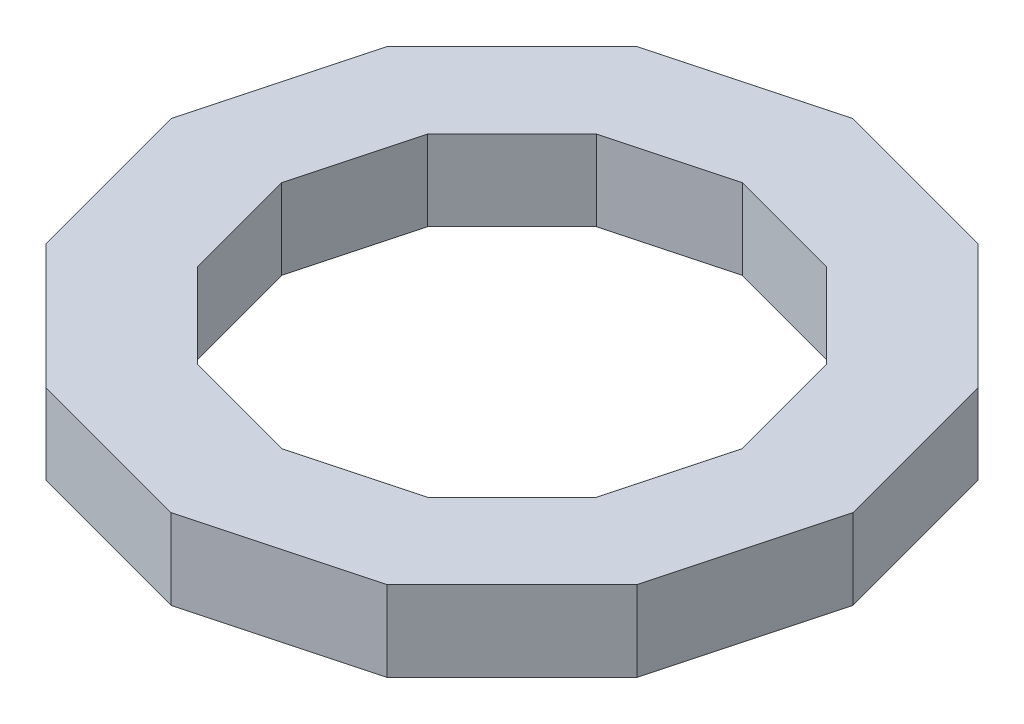
ISO-10303-21;
HEADER;
FILE_DESCRIPTION(('STEP AP214'),'2;1');
FILE_NAME('part.step','',(''),(''),'','','');
FILE_SCHEMA(('AUTOMOTIVE_DESIGN { 1 0 10303 214 1 1 1 1 }'));
ENDSEC;
DATA;
#1=APPLICATION_CONTEXT('core data for automotive mechanical design processes');
#2=APPLICATION_PROTOCOL_DEFINITION('international standard','automotive_design',2000,#1);
#3=PRODUCT_CONTEXT('',#1,'mechanical');
#4=PRODUCT('Part','Part','',(#3));
#5=PRODUCT_RELATED_PRODUCT_CATEGORY('part','',(#4));
#6=PRODUCT_DEFINITION_FORMATION('','',#4);
#7=PRODUCT_DEFINITION_CONTEXT('part definition',#1,'design');
#8=PRODUCT_DEFINITION('design','',#6,#7);
#9=PRODUCT_DEFINITION_SHAPE('','',#8);
#10=(LENGTH_UNIT() NAMED_UNIT(*) SI_UNIT(.MILLI.,.METRE.));
#11=(NAMED_UNIT(*) PLANE_ANGLE_UNIT() SI_UNIT($,.RADIAN.));
#12=(NAMED_UNIT(*) SI_UNIT($,.STERADIAN.) SOLID_ANGLE_UNIT());
#13=UNCERTAINTY_MEASURE_WITH_UNIT(LENGTH_MEASURE(1.E-05),#10,'distance_accuracy_value','');
#14=(GEOMETRIC_REPRESENTATION_CONTEXT(3) GLOBAL_UNCERTAINTY_ASSIGNED_CONTEXT((#13)) GLOBAL_UNIT_ASSIGNED_CONTEXT((#10,
#11,#12)) REPRESENTATION_CONTEXT('',''));
#15=CARTESIAN_POINT('',(0.,0.,0.));
#16=DIRECTION('',(0.,0.,1.));
#17=DIRECTION('',(1.,0.,0.));
#18=AXIS2_PLACEMENT_3D('',#15,#16,#17);
#19=CARTESIAN_POINT('',(0.,19.05,0.));
#20=DIRECTION('',(0.,1.,0.));
#21=DIRECTION('',(0.,0.,1.));
#22=AXIS2_PLACEMENT_3D('',#19,#20,#21);
#23=PLANE('',#22);
#24=DIRECTION('',(0.258819045102521,0.,-0.965925826289068));
#25=VECTOR('',#24,1.);
#26=CARTESIAN_POINT('',(70.1167965793031,19.05,40.4819513797749));
#27=LINE('',#26,#25);
#28=CARTESIAN_POINT('',(70.1167965793031,19.05,40.4819513797749));
#29=VERTEX_POINT('',#28);
#30=CARTESIAN_POINT('',(80.9639027595498,19.05,0.));
#31=VERTEX_POINT('',#30);
#32=EDGE_CURVE('E302',#29,#31,#27,.T.);
#33=ORIENTED_EDGE('',*,*,#32,.T.);
#34=DIRECTION('',(-0.25881904510252,0.,-0.965925826289068));
#35=VECTOR('',#34,1.);
#36=CARTESIAN_POINT('',(80.9639027595498,19.05,0.));
#37=LINE('',#36,#35);
#38=CARTESIAN_POINT('',(70.1167965793031,19.05,-40.4819513797749));
#39=VERTEX_POINT('',#38);
#40=EDGE_CURVE('E305',#31,#39,#37,.T.);
#41=ORIENTED_EDGE('',*,*,#40,.T.);
#42=DIRECTION('',(-0.707106781186548,0.,-0.707106781186547));
#43=VECTOR('',#42,1.);
#44=CARTESIAN_POINT('',(70.1167965793031,19.05,-40.4819513797749));
#45=LINE('',#44,#43);
#46=CARTESIAN_POINT('',(40.4819513797748,19.05,-70.1167965793032));
#47=VERTEX_POINT('',#46);
#48=EDGE_CURVE('E309',#39,#47,#45,.T.);
#49=ORIENTED_EDGE('',*,*,#48,.T.);
#50=DIRECTION('',(-0.965925826289068,0.,-0.258819045102521));
#51=VECTOR('',#50,1.);
#52=CARTESIAN_POINT('',(40.4819513797748,19.05,-70.1167965793032));
#53=LINE('',#52,#51);
#54=CARTESIAN_POINT('',(0.,19.05,-80.9639027595498));
#55=VERTEX_POINT('',#54);
#56=EDGE_CURVE('E311',#47,#55,#53,.T.);
#57=ORIENTED_EDGE('',*,*,#56,.T.);
#58=DIRECTION('',(-0.965925826289068,0.,0.258819045102521));
#59=VECTOR('',#58,1.);
#60=CARTESIAN_POINT('',(0.,19.05,-80.9639027595498));
#61=LINE('',#60,#59);
#62=CARTESIAN_POINT('',(-40.4819513797749,19.05,-70.1167965793032));
#63=VERTEX_POINT('',#62);
#64=EDGE_CURVE('E313',#55,#63,#61,.T.);
#65=ORIENTED_EDGE('',*,*,#64,.T.);
#66=DIRECTION('',(-0.707106781186547,0.,0.707106781186548));
#67=VECTOR('',#66,1.);
#68=CARTESIAN_POINT('',(-40.4819513797749,19.05,-70.1167965793032));
#69=LINE('',#68,#67);
#70=CARTESIAN_POINT('',(-70.1167965793031,19.05,-40.4819513797749));
#71=VERTEX_POINT('',#70);
#72=EDGE_CURVE('E315',#63,#71,#69,.T.);
#73=ORIENTED_EDGE('',*,*,#72,.T.);
#74=DIRECTION('',(-0.258819045102521,0.,0.965925826289068));
#75=VECTOR('',#74,1.);
#76=CARTESIAN_POINT('',(-70.1167965793031,19.05,-40.4819513797749));
#77=LINE('',#76,#75);
#78=CARTESIAN_POINT('',(-80.9639027595498,19.05,0.));
#79=VERTEX_POINT('',#78);
#80=EDGE_CURVE('E317',#71,#79,#77,.T.);
#81=ORIENTED_EDGE('',*,*,#80,.T.);
#82=DIRECTION('',(0.25881904510252,0.,0.965925826289068));
#83=VECTOR('',#82,1.);
#84=CARTESIAN_POINT('',(-80.9639027595498,19.05,0.));
#85=LINE('',#84,#83);
#86=CARTESIAN_POINT('',(-70.1167965793032,19.05,40.4819513797749));
#87=VERTEX_POINT('',#86);
#88=EDGE_CURVE('E319',#79,#87,#85,.T.);
#89=ORIENTED_EDGE('',*,*,#88,.T.);
#90=DIRECTION('',(0.707106781186547,0.,0.707106781186547));
#91=VECTOR('',#90,1.);
#92=CARTESIAN_POINT('',(-70.1167965793032,19.05,40.4819513797749));
#93=LINE('',#92,#91);
#94=CARTESIAN_POINT('',(-40.4819513797749,19.05,70.1167965793031));
#95=VERTEX_POINT('',#94);
#96=EDGE_CURVE('E321',#87,#95,#93,.T.);
#97=ORIENTED_EDGE('',*,*,#96,.T.);
#98=DIRECTION('',(0.965925826289068,0.,0.258819045102521));
#99=VECTOR('',#98,1.);
#100=CARTESIAN_POINT('',(-40.4819513797749,19.05,70.1167965793031));
#101=LINE('',#100,#99);
#102=CARTESIAN_POINT('',(0.,19.05,80.9639027595498));
#103=VERTEX_POINT('',#102);
#104=EDGE_CURVE('E324',#95,#103,#101,.T.);
#105=ORIENTED_EDGE('',*,*,#104,.T.);
#106=DIRECTION('',(0.965925826289068,0.,-0.25881904510252));
#107=VECTOR('',#106,1.);
#108=CARTESIAN_POINT('',(0.,19.05,80.9639027595498));
#109=LINE('',#108,#107);
#110=CARTESIAN_POINT('',(40.4819513797749,19.05,70.1167965793031));
#111=VERTEX_POINT('',#110);
#112=EDGE_CURVE('E326',#103,#111,#109,.T.);
#113=ORIENTED_EDGE('',*,*,#112,.T.);
#114=DIRECTION('',(0.707106781186548,0.,-0.707106781186547));
#115=VECTOR('',#114,1.);
#116=CARTESIAN_POINT('',(40.4819513797749,19.05,70.1167965793031));
#117=LINE('',#116,#115);
#118=EDGE_CURVE('E328',#111,#29,#117,.T.);
#119=ORIENTED_EDGE('',*,*,#118,.T.);
#120=EDGE_LOOP('',(#33,#41,#49,#57,#65,#73,#81,#89,#97,#105,#113,#119));
#121=FACE_BOUND('',#120,.T.);
#122=DIRECTION('',(-0.258819045102521,0.,-0.965925826289068));
#123=VECTOR('',#122,1.);
#124=CARTESIAN_POINT('',(54.6678877771337,19.05,0.));
#125=LINE('',#124,#123);
#126=CARTESIAN_POINT('',(54.6678877771337,19.05,0.));
#127=VERTEX_POINT('',#126);
#128=CARTESIAN_POINT('',(47.3437795862346,19.05,-27.3339438885668));
#129=VERTEX_POINT('',#128);
#130=EDGE_CURVE('E204',#127,#129,#125,.T.);
#131=ORIENTED_EDGE('',*,*,#130,.F.);
#132=DIRECTION('',(0.258819045102521,0.,-0.965925826289068));
#133=VECTOR('',#132,1.);
#134=CARTESIAN_POINT('',(47.3437795862345,19.05,27.3339438885668));
#135=LINE('',#134,#133);
#136=CARTESIAN_POINT('',(47.3437795862345,19.05,27.3339438885668));
#137=VERTEX_POINT('',#136);
#138=EDGE_CURVE('E196',#137,#127,#135,.T.);
#139=ORIENTED_EDGE('',*,*,#138,.F.);
#140=DIRECTION('',(0.707106781186547,0.,-0.707106781186548));
#141=VECTOR('',#140,1.);
#142=CARTESIAN_POINT('',(27.3339438885668,19.05,47.3437795862346));
#143=LINE('',#142,#141);
#144=CARTESIAN_POINT('',(27.3339438885668,19.05,47.3437795862345));
#145=VERTEX_POINT('',#144);
#146=EDGE_CURVE('E245',#145,#137,#143,.T.);
#147=ORIENTED_EDGE('',*,*,#146,.F.);
#148=DIRECTION('',(0.965925826289068,0.,-0.25881904510252));
#149=VECTOR('',#148,1.);
#150=CARTESIAN_POINT('',(0.,19.05,54.6678877771337));
#151=LINE('',#150,#149);
#152=CARTESIAN_POINT('',(0.,19.05,54.6678877771337));
#153=VERTEX_POINT('',#152);
#154=EDGE_CURVE('E242',#153,#145,#151,.T.);
#155=ORIENTED_EDGE('',*,*,#154,.F.);
#156=DIRECTION('',(0.965925826289068,0.,0.258819045102521));
#157=VECTOR('',#156,1.);
#158=CARTESIAN_POINT('',(-27.3339438885668,19.05,47.3437795862346));
#159=LINE('',#158,#157);
#160=CARTESIAN_POINT('',(-27.3339438885668,19.05,47.3437795862346));
#161=VERTEX_POINT('',#160);
#162=EDGE_CURVE('E239',#161,#153,#159,.T.);
#163=ORIENTED_EDGE('',*,*,#162,.F.);
#164=DIRECTION('',(0.707106781186548,0.,0.707106781186547));
#165=VECTOR('',#164,1.);
#166=CARTESIAN_POINT('',(-47.3437795862346,19.05,27.3339438885668));
#167=LINE('',#166,#165);
#168=CARTESIAN_POINT('',(-47.3437795862346,19.05,27.3339438885668));
#169=VERTEX_POINT('',#168);
#170=EDGE_CURVE('E237',#169,#161,#167,.T.);
#171=ORIENTED_EDGE('',*,*,#170,.F.);
#172=DIRECTION('',(0.258819045102521,0.,0.965925826289068));
#173=VECTOR('',#172,1.);
#174=CARTESIAN_POINT('',(-54.6678877771337,19.05,0.));
#175=LINE('',#174,#173);
#176=CARTESIAN_POINT('',(-54.6678877771337,19.05,0.));
#177=VERTEX_POINT('',#176);
#178=EDGE_CURVE('E235',#177,#169,#175,.T.);
#179=ORIENTED_EDGE('',*,*,#178,.F.);
#180=DIRECTION('',(-0.258819045102521,0.,0.965925826289068));
#181=VECTOR('',#180,1.);
#182=CARTESIAN_POINT('',(-47.3437795862346,19.05,-27.3339438885668));
#183=LINE('',#182,#181);
#184=CARTESIAN_POINT('',(-47.3437795862346,19.05,-27.3339438885668));
#185=VERTEX_POINT('',#184);
#186=EDGE_CURVE('E233',#185,#177,#183,.T.);
#187=ORIENTED_EDGE('',*,*,#186,.F.);
#188=DIRECTION('',(-0.707106781186547,0.,0.707106781186548));
#189=VECTOR('',#188,1.);
#190=CARTESIAN_POINT('',(-27.3339438885668,19.05,-47.3437795862346));
#191=LINE('',#190,#189);
#192=CARTESIAN_POINT('',(-27.3339438885668,19.05,-47.3437795862346));
#193=VERTEX_POINT('',#192);
#194=EDGE_CURVE('E231',#193,#185,#191,.T.);
#195=ORIENTED_EDGE('',*,*,#194,.F.);
#196=DIRECTION('',(-0.965925826289068,0.,0.258819045102521));
#197=VECTOR('',#196,1.);
#198=CARTESIAN_POINT('',(0.,19.05,-54.6678877771337));
#199=LINE('',#198,#197);
#200=CARTESIAN_POINT('',(0.,19.05,-54.6678877771337));
#201=VERTEX_POINT('',#200);
#202=EDGE_CURVE('E228',#201,#193,#199,.T.);
#203=ORIENTED_EDGE('',*,*,#202,.F.);
#204=DIRECTION('',(-0.965925826289068,0.,-0.258819045102521));
#205=VECTOR('',#204,1.);
#206=CARTESIAN_POINT('',(27.3339438885668,19.05,-47.3437795862346));
#207=LINE('',#206,#205);
#208=CARTESIAN_POINT('',(27.3339438885668,19.05,-47.3437795862346));
#209=VERTEX_POINT('',#208);
#210=EDGE_CURVE('E223',#209,#201,#207,.T.);
#211=ORIENTED_EDGE('',*,*,#210,.F.);
#212=DIRECTION('',(-0.707106781186548,0.,-0.707106781186547));
#213=VECTOR('',#212,1.);
#214=CARTESIAN_POINT('',(47.3437795862346,19.05,-27.3339438885668));
#215=LINE('',#214,#213);
#216=EDGE_CURVE('E217',#129,#209,#215,.T.);
#217=ORIENTED_EDGE('',*,*,#216,.F.);
#218=EDGE_LOOP('',(#131,#139,#147,#155,#163,#171,#179,#187,#195,#203,#211,#217));
#219=FACE_BOUND('',#218,.T.);
#220=ADVANCED_FACE('F35',(#121,#219),#23,.T.);
#221=CARTESIAN_POINT('',(0.,0.,0.));
#222=DIRECTION('',(0.,1.,0.));
#223=DIRECTION('',(0.,0.,1.));
#224=AXIS2_PLACEMENT_3D('',#221,#222,#223);
#225=PLANE('',#224);
#226=DIRECTION('',(0.258819045102521,0.,-0.965925826289068));
#227=VECTOR('',#226,1.);
#228=CARTESIAN_POINT('',(70.1167965793031,0.,40.4819513797749));
#229=LINE('',#228,#227);
#230=CARTESIAN_POINT('',(70.1167965793031,0.,40.4819513797749));
#231=VERTEX_POINT('',#230);
#232=CARTESIAN_POINT('',(80.9639027595498,0.,0.));
#233=VERTEX_POINT('',#232);
#234=EDGE_CURVE('E212',#231,#233,#229,.T.);
#235=ORIENTED_EDGE('',*,*,#234,.F.);
#236=DIRECTION('',(0.707106781186548,0.,-0.707106781186547));
#237=VECTOR('',#236,1.);
#238=CARTESIAN_POINT('',(40.4819513797749,0.,70.1167965793031));
#239=LINE('',#238,#237);
#240=CARTESIAN_POINT('',(40.4819513797749,0.,70.1167965793031));
#241=VERTEX_POINT('',#240);
#242=EDGE_CURVE('E306',#241,#231,#239,.T.);
#243=ORIENTED_EDGE('',*,*,#242,.F.);
#244=DIRECTION('',(0.965925826289068,0.,-0.25881904510252));
#245=VECTOR('',#244,1.);
#246=CARTESIAN_POINT('',(0.,0.,80.9639027595498));
#247=LINE('',#246,#245);
#248=CARTESIAN_POINT('',(0.,0.,80.9639027595498));
#249=VERTEX_POINT('',#248);
#250=EDGE_CURVE('E355',#249,#241,#247,.T.);
#251=ORIENTED_EDGE('',*,*,#250,.F.);
#252=DIRECTION('',(0.965925826289068,0.,0.258819045102521));
#253=VECTOR('',#252,1.);
#254=CARTESIAN_POINT('',(-40.4819513797749,0.,70.1167965793031));
#255=LINE('',#254,#253);
#256=CARTESIAN_POINT('',(-40.4819513797749,0.,70.1167965793031));
#257=VERTEX_POINT('',#256);
#258=EDGE_CURVE('E353',#257,#249,#255,.T.);
#259=ORIENTED_EDGE('',*,*,#258,.F.);
#260=DIRECTION('',(0.707106781186547,0.,0.707106781186547));
#261=VECTOR('',#260,1.);
#262=CARTESIAN_POINT('',(-70.1167965793032,0.,40.4819513797749));
#263=LINE('',#262,#261);
#264=CARTESIAN_POINT('',(-70.1167965793032,0.,40.4819513797749));
#265=VERTEX_POINT('',#264);
#266=EDGE_CURVE('E350',#265,#257,#263,.T.);
#267=ORIENTED_EDGE('',*,*,#266,.F.);
#268=DIRECTION('',(0.25881904510252,0.,0.965925826289068));
#269=VECTOR('',#268,1.);
#270=CARTESIAN_POINT('',(-80.9639027595498,0.,0.));
#271=LINE('',#270,#269);
#272=CARTESIAN_POINT('',(-80.9639027595498,0.,0.));
#273=VERTEX_POINT('',#272);
#274=EDGE_CURVE('E347',#273,#265,#271,.T.);
#275=ORIENTED_EDGE('',*,*,#274,.F.);
#276=DIRECTION('',(-0.258819045102521,0.,0.965925826289068));
#277=VECTOR('',#276,1.);
#278=CARTESIAN_POINT('',(-70.1167965793031,0.,-40.4819513797749));
#279=LINE('',#278,#277);
#280=CARTESIAN_POINT('',(-70.1167965793031,0.,-40.4819513797749));
#281=VERTEX_POINT('',#280);
#282=EDGE_CURVE('E345',#281,#273,#279,.T.);
#283=ORIENTED_EDGE('',*,*,#282,.F.);
#284=DIRECTION('',(-0.707106781186547,0.,0.707106781186548));
#285=VECTOR('',#284,1.);
#286=CARTESIAN_POINT('',(-40.4819513797749,0.,-70.1167965793032));
#287=LINE('',#286,#285);
#288=CARTESIAN_POINT('',(-40.4819513797749,0.,-70.1167965793032));
#289=VERTEX_POINT('',#288);
#290=EDGE_CURVE('E343',#289,#281,#287,.T.);
#291=ORIENTED_EDGE('',*,*,#290,.F.);
#292=DIRECTION('',(-0.965925826289068,0.,0.258819045102521));
#293=VECTOR('',#292,1.);
#294=CARTESIAN_POINT('',(0.,0.,-80.9639027595498));
#295=LINE('',#294,#293);
#296=CARTESIAN_POINT('',(0.,0.,-80.9639027595498));
#297=VERTEX_POINT('',#296);
#298=EDGE_CURVE('E340',#297,#289,#295,.T.);
#299=ORIENTED_EDGE('',*,*,#298,.F.);
#300=DIRECTION('',(-0.965925826289068,0.,-0.258819045102521));
#301=VECTOR('',#300,1.);
#302=CARTESIAN_POINT('',(40.4819513797748,0.,-70.1167965793032));
#303=LINE('',#302,#301);
#304=CARTESIAN_POINT('',(40.4819513797748,0.,-70.1167965793032));
#305=VERTEX_POINT('',#304);
#306=EDGE_CURVE('E338',#305,#297,#303,.T.);
#307=ORIENTED_EDGE('',*,*,#306,.F.);
#308=DIRECTION('',(-0.707106781186548,0.,-0.707106781186547));
#309=VECTOR('',#308,1.);
#310=CARTESIAN_POINT('',(70.1167965793031,0.,-40.4819513797749));
#311=LINE('',#310,#309);
#312=CARTESIAN_POINT('',(70.1167965793031,0.,-40.4819513797749));
#313=VERTEX_POINT('',#312);
#314=EDGE_CURVE('E336',#313,#305,#311,.T.);
#315=ORIENTED_EDGE('',*,*,#314,.F.);
#316=DIRECTION('',(-0.25881904510252,0.,-0.965925826289068));
#317=VECTOR('',#316,1.);
#318=CARTESIAN_POINT('',(80.9639027595498,0.,0.));
#319=LINE('',#318,#317);
#320=EDGE_CURVE('E334',#233,#313,#319,.T.);
#321=ORIENTED_EDGE('',*,*,#320,.F.);
#322=EDGE_LOOP('',(#235,#243,#251,#259,#267,#275,#283,#291,#299,#307,#315,#321));
#323=FACE_BOUND('',#322,.T.);
#324=DIRECTION('',(0.258819045102521,0.,-0.965925826289068));
#325=VECTOR('',#324,1.);
#326=CARTESIAN_POINT('',(47.3437795862345,0.,27.3339438885668));
#327=LINE('',#326,#325);
#328=CARTESIAN_POINT('',(47.3437795862345,0.,27.3339438885668));
#329=VERTEX_POINT('',#328);
#330=CARTESIAN_POINT('',(54.6678877771337,0.,0.));
#331=VERTEX_POINT('',#330);
#332=EDGE_CURVE('E58',#329,#331,#327,.T.);
#333=ORIENTED_EDGE('',*,*,#332,.T.);
#334=DIRECTION('',(-0.258819045102521,0.,-0.965925826289068));
#335=VECTOR('',#334,1.);
#336=CARTESIAN_POINT('',(54.6678877771337,0.,0.));
#337=LINE('',#336,#335);
#338=CARTESIAN_POINT('',(47.3437795862346,0.,-27.3339438885668));
#339=VERTEX_POINT('',#338);
#340=EDGE_CURVE('E211',#331,#339,#337,.T.);
#341=ORIENTED_EDGE('',*,*,#340,.T.);
#342=DIRECTION('',(-0.707106781186548,0.,-0.707106781186547));
#343=VECTOR('',#342,1.);
#344=CARTESIAN_POINT('',(47.3437795862346,0.,-27.3339438885668));
#345=LINE('',#344,#343);
#346=CARTESIAN_POINT('',(27.3339438885668,0.,-47.3437795862346));
#347=VERTEX_POINT('',#346);
#348=EDGE_CURVE('E250',#339,#347,#345,.T.);
#349=ORIENTED_EDGE('',*,*,#348,.T.);
#350=DIRECTION('',(-0.965925826289068,0.,-0.258819045102521));
#351=VECTOR('',#350,1.);
#352=CARTESIAN_POINT('',(27.3339438885668,0.,-47.3437795862346));
#353=LINE('',#352,#351);
#354=CARTESIAN_POINT('',(0.,0.,-54.6678877771337));
#355=VERTEX_POINT('',#354);
#356=EDGE_CURVE('E253',#347,#355,#353,.T.);
#357=ORIENTED_EDGE('',*,*,#356,.T.);
#358=DIRECTION('',(-0.965925826289068,0.,0.258819045102521));
#359=VECTOR('',#358,1.);
#360=CARTESIAN_POINT('',(0.,0.,-54.6678877771337));
#361=LINE('',#360,#359);
#362=CARTESIAN_POINT('',(-27.3339438885668,0.,-47.3437795862346));
#363=VERTEX_POINT('',#362);
#364=EDGE_CURVE('E257',#355,#363,#361,.T.);
#365=ORIENTED_EDGE('',*,*,#364,.T.);
#366=DIRECTION('',(-0.707106781186547,0.,0.707106781186548));
#367=VECTOR('',#366,1.);
#368=CARTESIAN_POINT('',(-27.3339438885668,0.,-47.3437795862346));
#369=LINE('',#368,#367);
#370=CARTESIAN_POINT('',(-47.3437795862346,0.,-27.3339438885668));
#371=VERTEX_POINT('',#370);
#372=EDGE_CURVE('E261',#363,#371,#369,.T.);
#373=ORIENTED_EDGE('',*,*,#372,.T.);
#374=DIRECTION('',(-0.258819045102521,0.,0.965925826289068));
#375=VECTOR('',#374,1.);
#376=CARTESIAN_POINT('',(-47.3437795862346,0.,-27.3339438885668));
#377=LINE('',#376,#375);
#378=CARTESIAN_POINT('',(-54.6678877771337,0.,0.));
#379=VERTEX_POINT('',#378);
#380=EDGE_CURVE('E264',#371,#379,#377,.T.);
#381=ORIENTED_EDGE('',*,*,#380,.T.);
#382=DIRECTION('',(0.258819045102521,0.,0.965925826289068));
#383=VECTOR('',#382,1.);
#384=CARTESIAN_POINT('',(-54.6678877771337,0.,0.));
#385=LINE('',#384,#383);
#386=CARTESIAN_POINT('',(-47.3437795862346,0.,27.3339438885668));
#387=VERTEX_POINT('',#386);
#388=EDGE_CURVE('E268',#379,#387,#385,.T.);
#389=ORIENTED_EDGE('',*,*,#388,.T.);
#390=DIRECTION('',(0.707106781186548,0.,0.707106781186547));
#391=VECTOR('',#390,1.);
#392=CARTESIAN_POINT('',(-47.3437795862346,0.,27.3339438885668));
#393=LINE('',#392,#391);
#394=CARTESIAN_POINT('',(-27.3339438885668,0.,47.3437795862346));
#395=VERTEX_POINT('',#394);
#396=EDGE_CURVE('E271',#387,#395,#393,.T.);
#397=ORIENTED_EDGE('',*,*,#396,.T.);
#398=DIRECTION('',(0.965925826289068,0.,0.258819045102521));
#399=VECTOR('',#398,1.);
#400=CARTESIAN_POINT('',(-27.3339438885668,0.,47.3437795862346));
#401=LINE('',#400,#399);
#402=CARTESIAN_POINT('',(0.,0.,54.6678877771337));
#403=VERTEX_POINT('',#402);
#404=EDGE_CURVE('E274',#395,#403,#401,.T.);
#405=ORIENTED_EDGE('',*,*,#404,.T.);
#406=DIRECTION('',(0.965925826289068,0.,-0.25881904510252));
#407=VECTOR('',#406,1.);
#408=CARTESIAN_POINT('',(0.,0.,54.6678877771337));
#409=LINE('',#408,#407);
#410=CARTESIAN_POINT('',(27.3339438885668,0.,47.3437795862346));
#411=VERTEX_POINT('',#410);
#412=EDGE_CURVE('E277',#403,#411,#409,.T.);
#413=ORIENTED_EDGE('',*,*,#412,.T.);
#414=DIRECTION('',(0.707106781186547,0.,-0.707106781186548));
#415=VECTOR('',#414,1.);
#416=CARTESIAN_POINT('',(27.3339438885668,0.,47.3437795862346));
#417=LINE('',#416,#415);
#418=EDGE_CURVE('E205',#411,#329,#417,.T.);
#419=ORIENTED_EDGE('',*,*,#418,.T.);
#420=EDGE_LOOP('',(#333,#341,#349,#357,#365,#373,#381,#389,#397,#405,#413,#419));
#421=FACE_BOUND('',#420,.T.);
#422=ADVANCED_FACE('F399',(#323,#421),#225,.F.);
#423=CARTESIAN_POINT('',(70.1167965793031,19.05,40.4819513797749));
#424=DIRECTION('',(-0.965925826289068,0.,-0.258819045102521));
#425=DIRECTION('',(-0.258819045102521,0.,0.965925826289068));
#426=AXIS2_PLACEMENT_3D('',#423,#424,#425);
#427=PLANE('',#426);
#428=ORIENTED_EDGE('',*,*,#234,.T.);
#429=DIRECTION('',(0.,-1.,0.));
#430=VECTOR('',#429,1.);
#431=CARTESIAN_POINT('',(80.9639027595498,19.05,0.));
#432=LINE('',#431,#430);
#433=EDGE_CURVE('E11',#31,#233,#432,.T.);
#434=ORIENTED_EDGE('',*,*,#433,.F.);
#435=ORIENTED_EDGE('',*,*,#32,.F.);
#436=DIRECTION('',(0.,-1.,0.));
#437=VECTOR('',#436,1.);
#438=CARTESIAN_POINT('',(70.1167965793031,19.05,40.4819513797749));
#439=LINE('',#438,#437);
#440=EDGE_CURVE('E330',#29,#231,#439,.T.);
#441=ORIENTED_EDGE('',*,*,#440,.T.);
#442=EDGE_LOOP('',(#428,#434,#435,#441));
#443=FACE_BOUND('',#442,.T.);
#444=ADVANCED_FACE('F37',(#443),#427,.F.);
#445=CARTESIAN_POINT('',(80.9639027595498,19.05,0.));
#446=DIRECTION('',(-0.965925826289068,0.,0.25881904510252));
#447=DIRECTION('',(0.258819045102521,0.,0.965925826289069));
#448=AXIS2_PLACEMENT_3D('',#445,#446,#447);
#449=PLANE('',#448);
#450=ORIENTED_EDGE('',*,*,#320,.T.);
#451=DIRECTION('',(0.,-1.,0.));
#452=VECTOR('',#451,1.);
#453=CARTESIAN_POINT('',(70.1167965793031,19.05,-40.4819513797749));
#454=LINE('',#453,#452);
#455=EDGE_CURVE('E43',#39,#313,#454,.T.);
#456=ORIENTED_EDGE('',*,*,#455,.F.);
#457=ORIENTED_EDGE('',*,*,#40,.F.);
#458=ORIENTED_EDGE('',*,*,#433,.T.);
#459=EDGE_LOOP('',(#450,#456,#457,#458));
#460=FACE_BOUND('',#459,.T.);
#461=ADVANCED_FACE('F416',(#460),#449,.F.);
#462=CARTESIAN_POINT('',(70.1167965793031,19.05,-40.4819513797749));
#463=DIRECTION('',(-0.707106781186547,0.,0.707106781186548));
#464=DIRECTION('',(0.707106781186548,0.,0.707106781186547));
#465=AXIS2_PLACEMENT_3D('',#462,#463,#464);
#466=PLANE('',#465);
#467=ORIENTED_EDGE('',*,*,#314,.T.);
#468=DIRECTION('',(0.,-1.,0.));
#469=VECTOR('',#468,1.);
#470=CARTESIAN_POINT('',(40.4819513797748,19.05,-70.1167965793032));
#471=LINE('',#470,#469);
#472=EDGE_CURVE('E386',#47,#305,#471,.T.);
#473=ORIENTED_EDGE('',*,*,#472,.F.);
#474=ORIENTED_EDGE('',*,*,#48,.F.);
#475=ORIENTED_EDGE('',*,*,#455,.T.);
#476=EDGE_LOOP('',(#467,#473,#474,#475));
#477=FACE_BOUND('',#476,.T.);
#478=ADVANCED_FACE('F393',(#477),#466,.F.);
#479=CARTESIAN_POINT('',(40.4819513797748,19.05,-70.1167965793032));
#480=DIRECTION('',(-0.258819045102521,0.,0.965925826289068));
#481=DIRECTION('',(0.965925826289068,0.,0.258819045102521));
#482=AXIS2_PLACEMENT_3D('',#479,#480,#481);
#483=PLANE('',#482);
#484=ORIENTED_EDGE('',*,*,#306,.T.);
#485=DIRECTION('',(0.,-1.,0.));
#486=VECTOR('',#485,1.);
#487=CARTESIAN_POINT('',(0.,19.05,-80.9639027595498));
#488=LINE('',#487,#486);
#489=EDGE_CURVE('E383',#55,#297,#488,.T.);
#490=ORIENTED_EDGE('',*,*,#489,.F.);
#491=ORIENTED_EDGE('',*,*,#56,.F.);
#492=ORIENTED_EDGE('',*,*,#472,.T.);
#493=EDGE_LOOP('',(#484,#490,#491,#492));
#494=FACE_BOUND('',#493,.T.);
#495=ADVANCED_FACE('F405',(#494),#483,.F.);
#496=CARTESIAN_POINT('',(0.,19.05,-80.9639027595498));
#497=DIRECTION('',(0.258819045102521,0.,0.965925826289068));
#498=DIRECTION('',(0.965925826289068,0.,-0.258819045102521));
#499=AXIS2_PLACEMENT_3D('',#496,#497,#498);
#500=PLANE('',#499);
#501=ORIENTED_EDGE('',*,*,#298,.T.);
#502=DIRECTION('',(0.,-1.,0.));
#503=VECTOR('',#502,1.);
#504=CARTESIAN_POINT('',(-40.4819513797749,19.05,-70.1167965793032));
#505=LINE('',#504,#503);
#506=EDGE_CURVE('E380',#63,#289,#505,.T.);
#507=ORIENTED_EDGE('',*,*,#506,.F.);
#508=ORIENTED_EDGE('',*,*,#64,.F.);
#509=ORIENTED_EDGE('',*,*,#489,.T.);
#510=EDGE_LOOP('',(#501,#507,#508,#509));
#511=FACE_BOUND('',#510,.T.);
#512=ADVANCED_FACE('F409',(#511),#500,.F.);
#513=CARTESIAN_POINT('',(-40.4819513797749,19.05,-70.1167965793032));
#514=DIRECTION('',(0.707106781186548,0.,0.707106781186547));
#515=DIRECTION('',(0.707106781186547,0.,-0.707106781186548));
#516=AXIS2_PLACEMENT_3D('',#513,#514,#515);
#517=PLANE('',#516);
#518=ORIENTED_EDGE('',*,*,#290,.T.);
#519=DIRECTION('',(0.,-1.,0.));
#520=VECTOR('',#519,1.);
#521=CARTESIAN_POINT('',(-70.1167965793031,19.05,-40.4819513797749));
#522=LINE('',#521,#520);
#523=EDGE_CURVE('E376',#71,#281,#522,.T.);
#524=ORIENTED_EDGE('',*,*,#523,.F.);
#525=ORIENTED_EDGE('',*,*,#72,.F.);
#526=ORIENTED_EDGE('',*,*,#506,.T.);
#527=EDGE_LOOP('',(#518,#524,#525,#526));
#528=FACE_BOUND('',#527,.T.);
#529=ADVANCED_FACE('F449',(#528),#517,.F.);
#530=CARTESIAN_POINT('',(-70.1167965793031,19.05,-40.4819513797749));
#531=DIRECTION('',(0.965925826289068,0.,0.258819045102521));
#532=DIRECTION('',(0.258819045102521,0.,-0.965925826289068));
#533=AXIS2_PLACEMENT_3D('',#530,#531,#532);
#534=PLANE('',#533);
#535=ORIENTED_EDGE('',*,*,#282,.T.);
#536=DIRECTION('',(0.,-1.,0.));
#537=VECTOR('',#536,1.);
#538=CARTESIAN_POINT('',(-80.9639027595498,19.05,0.));
#539=LINE('',#538,#537);
#540=EDGE_CURVE('E373',#79,#273,#539,.T.);
#541=ORIENTED_EDGE('',*,*,#540,.F.);
#542=ORIENTED_EDGE('',*,*,#80,.F.);
#543=ORIENTED_EDGE('',*,*,#523,.T.);
#544=EDGE_LOOP('',(#535,#541,#542,#543));
#545=FACE_BOUND('',#544,.T.);
#546=ADVANCED_FACE('F447',(#545),#534,.F.);
#547=CARTESIAN_POINT('',(-80.9639027595498,19.05,0.));
#548=DIRECTION('',(0.965925826289068,0.,-0.25881904510252));
#549=DIRECTION('',(-0.25881904510252,0.,-0.965925826289069));
#550=AXIS2_PLACEMENT_3D('',#547,#548,#549);
#551=PLANE('',#550);
#552=ORIENTED_EDGE('',*,*,#274,.T.);
#553=DIRECTION('',(0.,-1.,0.));
#554=VECTOR('',#553,1.);
#555=CARTESIAN_POINT('',(-70.1167965793032,19.05,40.4819513797749));
#556=LINE('',#555,#554);
#557=EDGE_CURVE('E370',#87,#265,#556,.T.);
#558=ORIENTED_EDGE('',*,*,#557,.F.);
#559=ORIENTED_EDGE('',*,*,#88,.F.);
#560=ORIENTED_EDGE('',*,*,#540,.T.);
#561=EDGE_LOOP('',(#552,#558,#559,#560));
#562=FACE_BOUND('',#561,.T.);
#563=ADVANCED_FACE('F443',(#562),#551,.F.);
#564=CARTESIAN_POINT('',(-70.1167965793032,19.05,40.4819513797749));
#565=DIRECTION('',(0.707106781186547,0.,-0.707106781186547));
#566=DIRECTION('',(-0.707106781186548,0.,-0.707106781186548));
#567=AXIS2_PLACEMENT_3D('',#564,#565,#566);
#568=PLANE('',#567);
#569=ORIENTED_EDGE('',*,*,#266,.T.);
#570=DIRECTION('',(0.,-1.,0.));
#571=VECTOR('',#570,1.);
#572=CARTESIAN_POINT('',(-40.4819513797749,19.05,70.1167965793031));
#573=LINE('',#572,#571);
#574=EDGE_CURVE('E367',#95,#257,#573,.T.);
#575=ORIENTED_EDGE('',*,*,#574,.F.);
#576=ORIENTED_EDGE('',*,*,#96,.F.);
#577=ORIENTED_EDGE('',*,*,#557,.T.);
#578=EDGE_LOOP('',(#569,#575,#576,#577));
#579=FACE_BOUND('',#578,.T.);
#580=ADVANCED_FACE('F438',(#579),#568,.F.);
#581=CARTESIAN_POINT('',(-40.4819513797749,19.05,70.1167965793031));
#582=DIRECTION('',(0.258819045102521,0.,-0.965925826289068));
#583=DIRECTION('',(-0.965925826289068,0.,-0.258819045102521));
#584=AXIS2_PLACEMENT_3D('',#581,#582,#583);
#585=PLANE('',#584);
#586=ORIENTED_EDGE('',*,*,#258,.T.);
#587=DIRECTION('',(0.,-1.,0.));
#588=VECTOR('',#587,1.);
#589=CARTESIAN_POINT('',(0.,19.05,80.9639027595498));
#590=LINE('',#589,#588);
#591=EDGE_CURVE('E364',#103,#249,#590,.T.);
#592=ORIENTED_EDGE('',*,*,#591,.F.);
#593=ORIENTED_EDGE('',*,*,#104,.F.);
#594=ORIENTED_EDGE('',*,*,#574,.T.);
#595=EDGE_LOOP('',(#586,#592,#593,#594));
#596=FACE_BOUND('',#595,.T.);
#597=ADVANCED_FACE('F432',(#596),#585,.F.);
#598=CARTESIAN_POINT('',(0.,19.05,80.9639027595498));
#599=DIRECTION('',(-0.25881904510252,0.,-0.965925826289068));
#600=DIRECTION('',(-0.965925826289069,0.,0.25881904510252));
#601=AXIS2_PLACEMENT_3D('',#598,#599,#600);
#602=PLANE('',#601);
#603=ORIENTED_EDGE('',*,*,#250,.T.);
#604=DIRECTION('',(0.,-1.,0.));
#605=VECTOR('',#604,1.);
#606=CARTESIAN_POINT('',(40.4819513797749,19.05,70.1167965793031));
#607=LINE('',#606,#605);
#608=EDGE_CURVE('E361',#111,#241,#607,.T.);
#609=ORIENTED_EDGE('',*,*,#608,.F.);
#610=ORIENTED_EDGE('',*,*,#112,.F.);
#611=ORIENTED_EDGE('',*,*,#591,.T.);
#612=EDGE_LOOP('',(#603,#609,#610,#611));
#613=FACE_BOUND('',#612,.T.);
#614=ADVANCED_FACE('F428',(#613),#602,.F.);
#615=CARTESIAN_POINT('',(40.4819513797749,19.05,70.1167965793031));
#616=DIRECTION('',(-0.707106781186547,0.,-0.707106781186548));
#617=DIRECTION('',(-0.707106781186548,0.,0.707106781186547));
#618=AXIS2_PLACEMENT_3D('',#615,#616,#617);
#619=PLANE('',#618);
#620=ORIENTED_EDGE('',*,*,#242,.T.);
#621=ORIENTED_EDGE('',*,*,#440,.F.);
#622=ORIENTED_EDGE('',*,*,#118,.F.);
#623=ORIENTED_EDGE('',*,*,#608,.T.);
#624=EDGE_LOOP('',(#620,#621,#622,#623));
#625=FACE_BOUND('',#624,.T.);
#626=ADVANCED_FACE('F423',(#625),#619,.F.);
#627=CARTESIAN_POINT('',(47.3437795862345,19.05,27.3339438885668));
#628=DIRECTION('',(-0.965925826289068,0.,-0.258819045102521));
#629=DIRECTION('',(-0.258819045102521,0.,0.965925826289068));
#630=AXIS2_PLACEMENT_3D('',#627,#628,#629);
#631=PLANE('',#630);
#632=ORIENTED_EDGE('',*,*,#332,.F.);
#633=DIRECTION('',(0.,-1.,0.));
#634=VECTOR('',#633,1.);
#635=CARTESIAN_POINT('',(47.3437795862345,19.05,27.3339438885668));
#636=LINE('',#635,#634);
#637=EDGE_CURVE('E200',#137,#329,#636,.T.);
#638=ORIENTED_EDGE('',*,*,#637,.F.);
#639=ORIENTED_EDGE('',*,*,#138,.T.);
#640=DIRECTION('',(0.,-1.,0.));
#641=VECTOR('',#640,1.);
#642=CARTESIAN_POINT('',(54.6678877771337,19.05,0.));
#643=LINE('',#642,#641);
#644=EDGE_CURVE('E199',#127,#331,#643,.T.);
#645=ORIENTED_EDGE('',*,*,#644,.T.);
#646=EDGE_LOOP('',(#632,#638,#639,#645));
#647=FACE_BOUND('',#646,.T.);
#648=ADVANCED_FACE('F198',(#647),#631,.T.);
#649=CARTESIAN_POINT('',(54.6678877771337,19.05,0.));
#650=DIRECTION('',(-0.965925826289068,0.,0.258819045102521));
#651=DIRECTION('',(0.258819045102521,0.,0.965925826289068));
#652=AXIS2_PLACEMENT_3D('',#649,#650,#651);
#653=PLANE('',#652);
#654=ORIENTED_EDGE('',*,*,#340,.F.);
#655=ORIENTED_EDGE('',*,*,#644,.F.);
#656=ORIENTED_EDGE('',*,*,#130,.T.);
#657=DIRECTION('',(0.,-1.,0.));
#658=VECTOR('',#657,1.);
#659=CARTESIAN_POINT('',(47.3437795862346,19.05,-27.3339438885668));
#660=LINE('',#659,#658);
#661=EDGE_CURVE('E213',#129,#339,#660,.T.);
#662=ORIENTED_EDGE('',*,*,#661,.T.);
#663=EDGE_LOOP('',(#654,#655,#656,#662));
#664=FACE_BOUND('',#663,.T.);
#665=ADVANCED_FACE('F208',(#664),#653,.T.);
#666=CARTESIAN_POINT('',(47.3437795862346,19.05,-27.3339438885668));
#667=DIRECTION('',(-0.707106781186547,0.,0.707106781186548));
#668=DIRECTION('',(0.707106781186548,0.,0.707106781186547));
#669=AXIS2_PLACEMENT_3D('',#666,#667,#668);
#670=PLANE('',#669);
#671=ORIENTED_EDGE('',*,*,#348,.F.);
#672=ORIENTED_EDGE('',*,*,#661,.F.);
#673=ORIENTED_EDGE('',*,*,#216,.T.);
#674=DIRECTION('',(0.,-1.,0.));
#675=VECTOR('',#674,1.);
#676=CARTESIAN_POINT('',(27.3339438885668,19.05,-47.3437795862346));
#677=LINE('',#676,#675);
#678=EDGE_CURVE('E299',#209,#347,#677,.T.);
#679=ORIENTED_EDGE('',*,*,#678,.T.);
#680=EDGE_LOOP('',(#671,#672,#673,#679));
#681=FACE_BOUND('',#680,.T.);
#682=ADVANCED_FACE('F507',(#681),#670,.T.);
#683=CARTESIAN_POINT('',(27.3339438885668,19.05,-47.3437795862346));
#684=DIRECTION('',(-0.258819045102521,0.,0.965925826289068));
#685=DIRECTION('',(0.965925826289068,0.,0.258819045102521));
#686=AXIS2_PLACEMENT_3D('',#683,#684,#685);
#687=PLANE('',#686);
#688=ORIENTED_EDGE('',*,*,#356,.F.);
#689=ORIENTED_EDGE('',*,*,#678,.F.);
#690=ORIENTED_EDGE('',*,*,#210,.T.);
#691=DIRECTION('',(0.,-1.,0.));
#692=VECTOR('',#691,1.);
#693=CARTESIAN_POINT('',(0.,19.05,-54.6678877771337));
#694=LINE('',#693,#692);
#695=EDGE_CURVE('E297',#201,#355,#694,.T.);
#696=ORIENTED_EDGE('',*,*,#695,.T.);
#697=EDGE_LOOP('',(#688,#689,#690,#696));
#698=FACE_BOUND('',#697,.T.);
#699=ADVANCED_FACE('F513',(#698),#687,.T.);
#700=CARTESIAN_POINT('',(0.,19.05,-54.6678877771337));
#701=DIRECTION('',(0.258819045102521,0.,0.965925826289068));
#702=DIRECTION('',(0.965925826289068,0.,-0.258819045102521));
#703=AXIS2_PLACEMENT_3D('',#700,#701,#702);
#704=PLANE('',#703);
#705=ORIENTED_EDGE('',*,*,#364,.F.);
#706=ORIENTED_EDGE('',*,*,#695,.F.);
#707=ORIENTED_EDGE('',*,*,#202,.T.);
#708=DIRECTION('',(0.,-1.,0.));
#709=VECTOR('',#708,1.);
#710=CARTESIAN_POINT('',(-27.3339438885668,19.05,-47.3437795862346));
#711=LINE('',#710,#709);
#712=EDGE_CURVE('E295',#193,#363,#711,.T.);
#713=ORIENTED_EDGE('',*,*,#712,.T.);
#714=EDGE_LOOP('',(#705,#706,#707,#713));
#715=FACE_BOUND('',#714,.T.);
#716=ADVANCED_FACE('F521',(#715),#704,.T.);
#717=CARTESIAN_POINT('',(-27.3339438885668,19.05,-47.3437795862346));
#718=DIRECTION('',(0.707106781186548,0.,0.707106781186547));
#719=DIRECTION('',(0.707106781186547,0.,-0.707106781186548));
#720=AXIS2_PLACEMENT_3D('',#717,#718,#719);
#721=PLANE('',#720);
#722=ORIENTED_EDGE('',*,*,#372,.F.);
#723=ORIENTED_EDGE('',*,*,#712,.F.);
#724=ORIENTED_EDGE('',*,*,#194,.T.);
#725=DIRECTION('',(0.,-1.,0.));
#726=VECTOR('',#725,1.);
#727=CARTESIAN_POINT('',(-47.3437795862346,19.05,-27.3339438885668));
#728=LINE('',#727,#726);
#729=EDGE_CURVE('E293',#185,#371,#728,.T.);
#730=ORIENTED_EDGE('',*,*,#729,.T.);
#731=EDGE_LOOP('',(#722,#723,#724,#730));
#732=FACE_BOUND('',#731,.T.);
#733=ADVANCED_FACE('F529',(#732),#721,.T.);
#734=CARTESIAN_POINT('',(-47.3437795862346,19.05,-27.3339438885668));
#735=DIRECTION('',(0.965925826289068,0.,0.258819045102521));
#736=DIRECTION('',(0.258819045102521,0.,-0.965925826289068));
#737=AXIS2_PLACEMENT_3D('',#734,#735,#736);
#738=PLANE('',#737);
#739=ORIENTED_EDGE('',*,*,#380,.F.);
#740=ORIENTED_EDGE('',*,*,#729,.F.);
#741=ORIENTED_EDGE('',*,*,#186,.T.);
#742=DIRECTION('',(0.,-1.,0.));
#743=VECTOR('',#742,1.);
#744=CARTESIAN_POINT('',(-54.6678877771337,19.05,0.));
#745=LINE('',#744,#743);
#746=EDGE_CURVE('E291',#177,#379,#745,.T.);
#747=ORIENTED_EDGE('',*,*,#746,.T.);
#748=EDGE_LOOP('',(#739,#740,#741,#747));
#749=FACE_BOUND('',#748,.T.);
#750=ADVANCED_FACE('F536',(#749),#738,.T.);
#751=CARTESIAN_POINT('',(-54.6678877771337,19.05,0.));
#752=DIRECTION('',(0.965925826289068,0.,-0.258819045102521));
#753=DIRECTION('',(-0.258819045102521,0.,-0.965925826289068));
#754=AXIS2_PLACEMENT_3D('',#751,#752,#753);
#755=PLANE('',#754);
#756=ORIENTED_EDGE('',*,*,#388,.F.);
#757=ORIENTED_EDGE('',*,*,#746,.F.);
#758=ORIENTED_EDGE('',*,*,#178,.T.);
#759=DIRECTION('',(0.,-1.,0.));
#760=VECTOR('',#759,1.);
#761=CARTESIAN_POINT('',(-47.3437795862346,19.05,27.3339438885668));
#762=LINE('',#761,#760);
#763=EDGE_CURVE('E289',#169,#387,#762,.T.);
#764=ORIENTED_EDGE('',*,*,#763,.T.);
#765=EDGE_LOOP('',(#756,#757,#758,#764));
#766=FACE_BOUND('',#765,.T.);
#767=ADVANCED_FACE('F544',(#766),#755,.T.);
#768=CARTESIAN_POINT('',(-47.3437795862346,19.05,27.3339438885668));
#769=DIRECTION('',(0.707106781186547,0.,-0.707106781186548));
#770=DIRECTION('',(-0.707106781186548,0.,-0.707106781186547));
#771=AXIS2_PLACEMENT_3D('',#768,#769,#770);
#772=PLANE('',#771);
#773=ORIENTED_EDGE('',*,*,#396,.F.);
#774=ORIENTED_EDGE('',*,*,#763,.F.);
#775=ORIENTED_EDGE('',*,*,#170,.T.);
#776=DIRECTION('',(0.,-1.,0.));
#777=VECTOR('',#776,1.);
#778=CARTESIAN_POINT('',(-27.3339438885668,19.05,47.3437795862346));
#779=LINE('',#778,#777);
#780=EDGE_CURVE('E287',#161,#395,#779,.T.);
#781=ORIENTED_EDGE('',*,*,#780,.T.);
#782=EDGE_LOOP('',(#773,#774,#775,#781));
#783=FACE_BOUND('',#782,.T.);
#784=ADVANCED_FACE('F553',(#783),#772,.T.);
#785=CARTESIAN_POINT('',(-27.3339438885668,19.05,47.3437795862346));
#786=DIRECTION('',(0.258819045102521,0.,-0.965925826289068));
#787=DIRECTION('',(-0.965925826289068,0.,-0.258819045102521));
#788=AXIS2_PLACEMENT_3D('',#785,#786,#787);
#789=PLANE('',#788);
#790=ORIENTED_EDGE('',*,*,#404,.F.);
#791=ORIENTED_EDGE('',*,*,#780,.F.);
#792=ORIENTED_EDGE('',*,*,#162,.T.);
#793=DIRECTION('',(0.,-1.,0.));
#794=VECTOR('',#793,1.);
#795=CARTESIAN_POINT('',(0.,19.05,54.6678877771337));
#796=LINE('',#795,#794);
#797=EDGE_CURVE('E285',#153,#403,#796,.T.);
#798=ORIENTED_EDGE('',*,*,#797,.T.);
#799=EDGE_LOOP('',(#790,#791,#792,#798));
#800=FACE_BOUND('',#799,.T.);
#801=ADVANCED_FACE('F560',(#800),#789,.T.);
#802=CARTESIAN_POINT('',(0.,19.05,54.6678877771337));
#803=DIRECTION('',(-0.25881904510252,0.,-0.965925826289068));
#804=DIRECTION('',(-0.965925826289068,0.,0.25881904510252));
#805=AXIS2_PLACEMENT_3D('',#802,#803,#804);
#806=PLANE('',#805);
#807=ORIENTED_EDGE('',*,*,#412,.F.);
#808=ORIENTED_EDGE('',*,*,#797,.F.);
#809=ORIENTED_EDGE('',*,*,#154,.T.);
#810=DIRECTION('',(0.,-1.,0.));
#811=VECTOR('',#810,1.);
#812=CARTESIAN_POINT('',(27.3339438885668,19.05,47.3437795862346));
#813=LINE('',#812,#811);
#814=EDGE_CURVE('E50',#145,#411,#813,.T.);
#815=ORIENTED_EDGE('',*,*,#814,.T.);
#816=EDGE_LOOP('',(#807,#808,#809,#815));
#817=FACE_BOUND('',#816,.T.);
#818=ADVANCED_FACE('F568',(#817),#806,.T.);
#819=CARTESIAN_POINT('',(27.3339438885668,19.05,47.3437795862346));
#820=DIRECTION('',(-0.707106781186548,0.,-0.707106781186547));
#821=DIRECTION('',(-0.707106781186547,0.,0.707106781186548));
#822=AXIS2_PLACEMENT_3D('',#819,#820,#821);
#823=PLANE('',#822);
#824=ORIENTED_EDGE('',*,*,#418,.F.);
#825=ORIENTED_EDGE('',*,*,#814,.F.);
#826=ORIENTED_EDGE('',*,*,#146,.T.);
#827=ORIENTED_EDGE('',*,*,#637,.T.);
#828=EDGE_LOOP('',(#824,#825,#826,#827));
#829=FACE_BOUND('',#828,.T.);
#830=ADVANCED_FACE('F576',(#829),#823,.T.);
#831=CLOSED_SHELL('',(#220,#422,#444,#461,#478,#495,#512,#529,#546,#563,#580,#597,#614,#626,
#648,#665,#682,#699,#716,#733,#750,#767,#784,#801,#818,#830));
#832=MANIFOLD_SOLID_BREP('B2',#831);
#833=ADVANCED_BREP_SHAPE_REPRESENTATION('',(#18,#832),#14);
#834=SHAPE_DEFINITION_REPRESENTATION(#9,#833);
ENDSEC;
END-ISO-10303-21;
